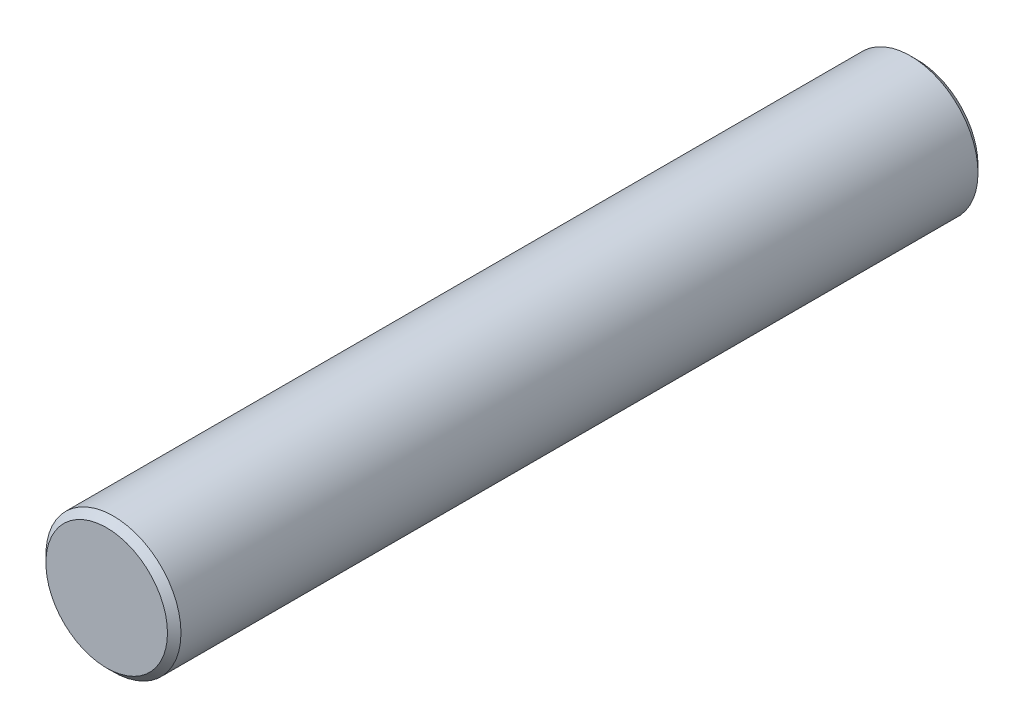
ISO-10303-21;
HEADER;
FILE_DESCRIPTION(('STEP AP214'),'2;1');
FILE_NAME('part.step','',(''),(''),'','','');
FILE_SCHEMA(('AUTOMOTIVE_DESIGN { 1 0 10303 214 1 1 1 1 }'));
ENDSEC;
DATA;
#1=APPLICATION_CONTEXT('core data for automotive mechanical design processes');
#2=APPLICATION_PROTOCOL_DEFINITION('international standard','automotive_design',2000,#1);
#3=PRODUCT_CONTEXT('',#1,'mechanical');
#4=PRODUCT('Part','Part','',(#3));
#5=PRODUCT_RELATED_PRODUCT_CATEGORY('part','',(#4));
#6=PRODUCT_DEFINITION_FORMATION('','',#4);
#7=PRODUCT_DEFINITION_CONTEXT('part definition',#1,'design');
#8=PRODUCT_DEFINITION('design','',#6,#7);
#9=PRODUCT_DEFINITION_SHAPE('','',#8);
#10=(LENGTH_UNIT() NAMED_UNIT(*) SI_UNIT(.MILLI.,.METRE.));
#11=(NAMED_UNIT(*) PLANE_ANGLE_UNIT() SI_UNIT($,.RADIAN.));
#12=(NAMED_UNIT(*) SI_UNIT($,.STERADIAN.) SOLID_ANGLE_UNIT());
#13=UNCERTAINTY_MEASURE_WITH_UNIT(LENGTH_MEASURE(1.E-05),#10,'distance_accuracy_value','');
#14=(GEOMETRIC_REPRESENTATION_CONTEXT(3) GLOBAL_UNCERTAINTY_ASSIGNED_CONTEXT((#13)) GLOBAL_UNIT_ASSIGNED_CONTEXT((#10,
#11,#12)) REPRESENTATION_CONTEXT('',''));
#15=CARTESIAN_POINT('',(0.,0.,0.));
#16=DIRECTION('',(0.,0.,1.));
#17=DIRECTION('',(1.,0.,0.));
#18=AXIS2_PLACEMENT_3D('',#15,#16,#17);
#19=CARTESIAN_POINT('',(0.,0.,6.));
#20=DIRECTION('',(0.,0.,-1.));
#21=DIRECTION('',(-1.,0.,0.));
#22=AXIS2_PLACEMENT_3D('',#19,#20,#21);
#23=CYLINDRICAL_SURFACE('',#22,1.);
#24=CARTESIAN_POINT('',(0.,0.,-5.9));
#25=DIRECTION('',(0.,0.,1.));
#26=DIRECTION('',(1.,0.,0.));
#27=AXIS2_PLACEMENT_3D('',#24,#25,#26);
#28=CIRCLE('',#27,1.);
#29=CARTESIAN_POINT('',(1.,0.,-5.9));
#30=VERTEX_POINT('',#29);
#31=EDGE_CURVE('E45',#30,#30,#28,.T.);
#32=ORIENTED_EDGE('',*,*,#31,.T.);
#33=EDGE_LOOP('',(#32));
#34=FACE_BOUND('',#33,.T.);
#35=CARTESIAN_POINT('',(0.,0.,5.9));
#36=DIRECTION('',(0.,0.,1.));
#37=DIRECTION('',(1.,0.,0.));
#38=AXIS2_PLACEMENT_3D('',#35,#36,#37);
#39=CIRCLE('',#38,1.);
#40=CARTESIAN_POINT('',(1.,0.,5.9));
#41=VERTEX_POINT('',#40);
#42=EDGE_CURVE('E49',#41,#41,#39,.F.);
#43=ORIENTED_EDGE('',*,*,#42,.T.);
#44=EDGE_LOOP('',(#43));
#45=FACE_BOUND('',#44,.T.);
#46=ADVANCED_FACE('F33',(#34,#45),#23,.T.);
#47=CARTESIAN_POINT('',(0.,0.,6.));
#48=DIRECTION('',(0.,0.,1.));
#49=DIRECTION('',(1.,0.,0.));
#50=AXIS2_PLACEMENT_3D('',#47,#48,#49);
#51=PLANE('',#50);
#52=CARTESIAN_POINT('',(0.,0.,6.));
#53=DIRECTION('',(0.,0.,1.));
#54=DIRECTION('',(1.,0.,0.));
#55=AXIS2_PLACEMENT_3D('',#52,#53,#54);
#56=CIRCLE('',#55,0.9);
#57=CARTESIAN_POINT('',(0.9,0.,6.));
#58=VERTEX_POINT('',#57);
#59=EDGE_CURVE('E10',#58,#58,#56,.T.);
#60=ORIENTED_EDGE('',*,*,#59,.T.);
#61=EDGE_LOOP('',(#60));
#62=FACE_BOUND('',#61,.T.);
#63=ADVANCED_FACE('F65',(#62),#51,.T.);
#64=CARTESIAN_POINT('',(0.,0.,-6.));
#65=DIRECTION('',(0.,0.,1.));
#66=DIRECTION('',(1.,0.,0.));
#67=AXIS2_PLACEMENT_3D('',#64,#65,#66);
#68=PLANE('',#67);
#69=CARTESIAN_POINT('',(0.,0.,-6.));
#70=DIRECTION('',(0.,0.,1.));
#71=DIRECTION('',(1.,0.,0.));
#72=AXIS2_PLACEMENT_3D('',#69,#70,#71);
#73=CIRCLE('',#72,0.9);
#74=CARTESIAN_POINT('',(0.9,0.,-6.));
#75=VERTEX_POINT('',#74);
#76=EDGE_CURVE('E41',#75,#75,#73,.F.);
#77=ORIENTED_EDGE('',*,*,#76,.T.);
#78=EDGE_LOOP('',(#77));
#79=FACE_BOUND('',#78,.T.);
#80=ADVANCED_FACE('F62',(#79),#68,.F.);
#81=CARTESIAN_POINT('',(0.,0.,-5.9));
#82=DIRECTION('',(0.,0.,1.));
#83=DIRECTION('',(1.,0.,0.));
#84=AXIS2_PLACEMENT_3D('',#81,#82,#83);
#85=CONICAL_SURFACE('',#84,1.,0.785398163397453);
#86=ORIENTED_EDGE('',*,*,#76,.F.);
#87=EDGE_LOOP('',(#86));
#88=FACE_BOUND('',#87,.T.);
#89=ORIENTED_EDGE('',*,*,#31,.F.);
#90=EDGE_LOOP('',(#89));
#91=FACE_BOUND('',#90,.T.);
#92=ADVANCED_FACE('F58',(#88,#91),#85,.T.);
#93=CARTESIAN_POINT('',(0.,0.,6.));
#94=DIRECTION('',(0.,0.,-1.));
#95=DIRECTION('',(-1.,0.,0.));
#96=AXIS2_PLACEMENT_3D('',#93,#94,#95);
#97=CONICAL_SURFACE('',#96,0.9,0.785398163397448);
#98=ORIENTED_EDGE('',*,*,#42,.F.);
#99=EDGE_LOOP('',(#98));
#100=FACE_BOUND('',#99,.T.);
#101=ORIENTED_EDGE('',*,*,#59,.F.);
#102=EDGE_LOOP('',(#101));
#103=FACE_BOUND('',#102,.T.);
#104=ADVANCED_FACE('F36',(#100,#103),#97,.T.);
#105=CLOSED_SHELL('',(#46,#63,#80,#92,#104));
#106=MANIFOLD_SOLID_BREP('B2',#105);
#107=ADVANCED_BREP_SHAPE_REPRESENTATION('',(#18,#106),#14);
#108=SHAPE_DEFINITION_REPRESENTATION(#9,#107);
ENDSEC;
END-ISO-10303-21;
